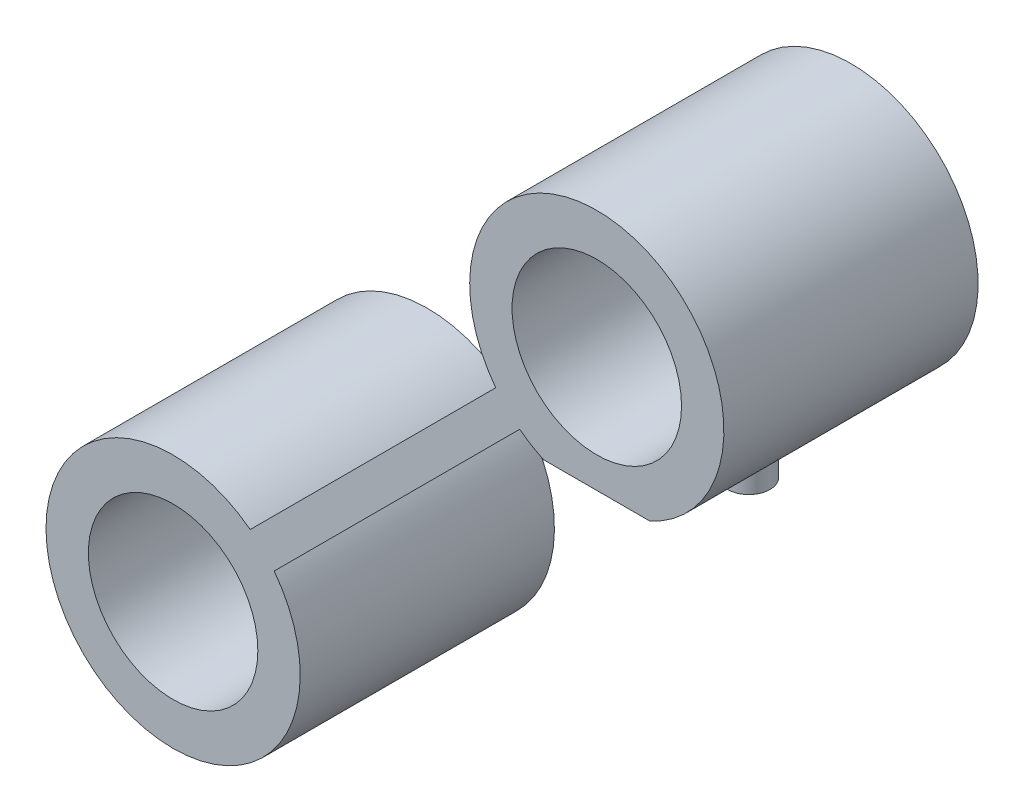
ISO-10303-21;
HEADER;
FILE_DESCRIPTION(('STEP AP214'),'2;1');
FILE_NAME('part.step','',(''),(''),'','','');
FILE_SCHEMA(('AUTOMOTIVE_DESIGN { 1 0 10303 214 1 1 1 1 }'));
ENDSEC;
DATA;
#1=APPLICATION_CONTEXT('core data for automotive mechanical design processes');
#2=APPLICATION_PROTOCOL_DEFINITION('international standard','automotive_design',2000,#1);
#3=PRODUCT_CONTEXT('',#1,'mechanical');
#4=PRODUCT('Part','Part','',(#3));
#5=PRODUCT_RELATED_PRODUCT_CATEGORY('part','',(#4));
#6=PRODUCT_DEFINITION_FORMATION('','',#4);
#7=PRODUCT_DEFINITION_CONTEXT('part definition',#1,'design');
#8=PRODUCT_DEFINITION('design','',#6,#7);
#9=PRODUCT_DEFINITION_SHAPE('','',#8);
#10=(LENGTH_UNIT() NAMED_UNIT(*) SI_UNIT(.MILLI.,.METRE.));
#11=(NAMED_UNIT(*) PLANE_ANGLE_UNIT() SI_UNIT($,.RADIAN.));
#12=(NAMED_UNIT(*) SI_UNIT($,.STERADIAN.) SOLID_ANGLE_UNIT());
#13=UNCERTAINTY_MEASURE_WITH_UNIT(LENGTH_MEASURE(1.E-05),#10,'distance_accuracy_value','');
#14=(GEOMETRIC_REPRESENTATION_CONTEXT(3) GLOBAL_UNCERTAINTY_ASSIGNED_CONTEXT((#13)) GLOBAL_UNIT_ASSIGNED_CONTEXT((#10,
#11,#12)) REPRESENTATION_CONTEXT('',''));
#15=CARTESIAN_POINT('',(0.,0.,0.));
#16=DIRECTION('',(0.,0.,1.));
#17=DIRECTION('',(1.,0.,0.));
#18=AXIS2_PLACEMENT_3D('',#15,#16,#17);
#19=CARTESIAN_POINT('',(40.9001782531195,36.3694822992735,-153.808748883995));
#20=DIRECTION('',(0.,-1.,0.));
#21=DIRECTION('',(0.,0.,-1.));
#22=AXIS2_PLACEMENT_3D('',#19,#20,#21);
#23=PLANE('',#22);
#24=DIRECTION('',(1.,0.,0.));
#25=VECTOR('',#24,1.);
#26=CARTESIAN_POINT('',(0.,36.3694822992735,30.));
#27=LINE('',#26,#25);
#28=CARTESIAN_POINT('',(43.7382919893855,36.3694822992735,30.));
#29=VERTEX_POINT('',#28);
#30=CARTESIAN_POINT('',(56.2617080106141,36.3694822992735,30.));
#31=VERTEX_POINT('',#30);
#32=EDGE_CURVE('E59',#29,#31,#27,.T.);
#33=ORIENTED_EDGE('',*,*,#32,.F.);
#34=DIRECTION('',(0.,0.,-1.));
#35=VECTOR('',#34,1.);
#36=CARTESIAN_POINT('',(43.7382919893855,36.3694822992735,30.));
#37=LINE('',#36,#35);
#38=CARTESIAN_POINT('',(43.7382919893855,36.3694822992735,0.));
#39=VERTEX_POINT('',#38);
#40=EDGE_CURVE('E68',#29,#39,#37,.T.);
#41=ORIENTED_EDGE('',*,*,#40,.T.);
#42=DIRECTION('',(1.,0.,0.));
#43=VECTOR('',#42,1.);
#44=CARTESIAN_POINT('',(0.,36.3694822992735,0.));
#45=LINE('',#44,#43);
#46=CARTESIAN_POINT('',(56.2617080106141,36.3694822992735,0.));
#47=VERTEX_POINT('',#46);
#48=EDGE_CURVE('E11',#39,#47,#45,.T.);
#49=ORIENTED_EDGE('',*,*,#48,.T.);
#50=DIRECTION('',(0.,0.,-1.));
#51=VECTOR('',#50,1.);
#52=CARTESIAN_POINT('',(56.2617080106141,36.3694822992735,30.));
#53=LINE('',#52,#51);
#54=EDGE_CURVE('E109',#47,#31,#53,.F.);
#55=ORIENTED_EDGE('',*,*,#54,.T.);
#56=EDGE_LOOP('',(#33,#41,#49,#55));
#57=FACE_BOUND('',#56,.T.);
#58=CARTESIAN_POINT('',(49.6260615815451,36.3694822992735,11.687427951216));
#59=DIRECTION('',(0.,-1.,0.));
#60=DIRECTION('',(0.,0.,-1.));
#61=AXIS2_PLACEMENT_3D('',#58,#59,#60);
#62=CIRCLE('',#61,2.5);
#63=CARTESIAN_POINT('',(49.6260615815451,36.3694822992735,9.18742795121602));
#64=VERTEX_POINT('',#63);
#65=EDGE_CURVE('E220',#64,#64,#62,.T.);
#66=ORIENTED_EDGE('',*,*,#65,.F.);
#67=EDGE_LOOP('',(#66));
#68=FACE_BOUND('',#67,.T.);
#69=ADVANCED_FACE('F43',(#57,#68),#23,.T.);
#70=CARTESIAN_POINT('',(49.9999999999998,49.9999999999998,30.));
#71=DIRECTION('',(0.,0.,-1.));
#72=DIRECTION('',(-1.,0.,0.));
#73=AXIS2_PLACEMENT_3D('',#70,#71,#72);
#74=CYLINDRICAL_SURFACE('',#73,15.0000000000001);
#75=ORIENTED_EDGE('',*,*,#40,.F.);
#76=CARTESIAN_POINT('',(49.9999999999998,49.9999999999998,30.));
#77=DIRECTION('',(0.,0.,1.));
#78=DIRECTION('',(1.,0.,0.));
#79=AXIS2_PLACEMENT_3D('',#76,#77,#78);
#80=CIRCLE('',#79,15.0000000000001);
#81=CARTESIAN_POINT('',(40.9023155415585,38.0738884168123,30.));
#82=VERTEX_POINT('',#81);
#83=EDGE_CURVE('E134',#82,#29,#80,.T.);
#84=ORIENTED_EDGE('',*,*,#83,.F.);
#85=DIRECTION('',(0.,0.,-1.));
#86=VECTOR('',#85,1.);
#87=CARTESIAN_POINT('',(40.9023155415585,38.0738884168123,30.));
#88=LINE('',#87,#86);
#89=CARTESIAN_POINT('',(40.9023155415585,38.0738884168123,0.));
#90=VERTEX_POINT('',#89);
#91=EDGE_CURVE('E153',#82,#90,#88,.T.);
#92=ORIENTED_EDGE('',*,*,#91,.T.);
#93=CARTESIAN_POINT('',(49.9999999999998,49.9999999999998,0.));
#94=DIRECTION('',(0.,0.,1.));
#95=DIRECTION('',(1.,0.,0.));
#96=AXIS2_PLACEMENT_3D('',#93,#94,#95);
#97=CIRCLE('',#96,15.0000000000001);
#98=EDGE_CURVE('E106',#90,#39,#97,.T.);
#99=ORIENTED_EDGE('',*,*,#98,.T.);
#100=EDGE_LOOP('',(#75,#84,#92,#99));
#101=FACE_BOUND('',#100,.T.);
#102=ADVANCED_FACE('F162',(#101),#74,.T.);
#103=ORIENTED_EDGE('',*,*,#54,.F.);
#104=CARTESIAN_POINT('',(38.0738884168123,40.9023155415585,0.));
#105=VERTEX_POINT('',#104);
#106=EDGE_CURVE('E100',#47,#105,#97,.T.);
#107=ORIENTED_EDGE('',*,*,#106,.T.);
#108=DIRECTION('',(0.,0.,-1.));
#109=VECTOR('',#108,1.);
#110=CARTESIAN_POINT('',(38.0738884168123,40.9023155415585,30.));
#111=LINE('',#110,#109);
#112=CARTESIAN_POINT('',(38.0738884168123,40.9023155415585,30.));
#113=VERTEX_POINT('',#112);
#114=EDGE_CURVE('E151',#113,#105,#111,.T.);
#115=ORIENTED_EDGE('',*,*,#114,.F.);
#116=EDGE_CURVE('E115',#31,#113,#80,.T.);
#117=ORIENTED_EDGE('',*,*,#116,.F.);
#118=EDGE_LOOP('',(#103,#107,#115,#117));
#119=FACE_BOUND('',#118,.T.);
#120=ADVANCED_FACE('F112',(#119),#74,.T.);
#121=CARTESIAN_POINT('',(0.,0.,30.));
#122=DIRECTION('',(0.,0.,1.));
#123=DIRECTION('',(1.,0.,0.));
#124=AXIS2_PLACEMENT_3D('',#121,#122,#123);
#125=PLANE('',#124);
#126=CARTESIAN_POINT('',(49.9999999999998,49.9999999999998,30.));
#127=DIRECTION('',(0.,0.,1.));
#128=DIRECTION('',(1.,0.,0.));
#129=AXIS2_PLACEMENT_3D('',#126,#127,#128);
#130=CIRCLE('',#129,10.);
#131=CARTESIAN_POINT('',(59.9999999999998,49.9999999999998,30.));
#132=VERTEX_POINT('',#131);
#133=EDGE_CURVE('E132',#132,#132,#130,.T.);
#134=ORIENTED_EDGE('',*,*,#133,.F.);
#135=EDGE_LOOP('',(#134));
#136=FACE_BOUND('',#135,.T.);
#137=CARTESIAN_POINT('',(0.,0.,30.));
#138=DIRECTION('',(0.,0.,1.));
#139=DIRECTION('',(1.,0.,0.));
#140=AXIS2_PLACEMENT_3D('',#137,#138,#139);
#141=CIRCLE('',#140,10.);
#142=CARTESIAN_POINT('',(10.,0.,30.));
#143=VERTEX_POINT('',#142);
#144=EDGE_CURVE('E124',#143,#143,#141,.T.);
#145=ORIENTED_EDGE('',*,*,#144,.F.);
#146=EDGE_LOOP('',(#145));
#147=FACE_BOUND('',#146,.T.);
#148=ORIENTED_EDGE('',*,*,#83,.T.);
#149=ORIENTED_EDGE('',*,*,#32,.T.);
#150=ORIENTED_EDGE('',*,*,#116,.T.);
#151=DIRECTION('',(-0.707106781186548,-0.707106781186547,0.));
#152=VECTOR('',#151,1.);
#153=CARTESIAN_POINT('',(-1.4142135623731,1.4142135623731,30.));
#154=LINE('',#153,#152);
#155=CARTESIAN_POINT('',(9.09768445844131,11.9261115831875,30.));
#156=VERTEX_POINT('',#155);
#157=EDGE_CURVE('E135',#113,#156,#154,.T.);
#158=ORIENTED_EDGE('',*,*,#157,.T.);
#159=CARTESIAN_POINT('',(0.,0.,30.));
#160=DIRECTION('',(0.,0.,1.));
#161=DIRECTION('',(1.,0.,0.));
#162=AXIS2_PLACEMENT_3D('',#159,#160,#161);
#163=CIRCLE('',#162,15.0000000000001);
#164=CARTESIAN_POINT('',(11.9261115831875,9.09768445844131,30.));
#165=VERTEX_POINT('',#164);
#166=EDGE_CURVE('E121',#156,#165,#163,.T.);
#167=ORIENTED_EDGE('',*,*,#166,.T.);
#168=DIRECTION('',(-0.707106781186547,-0.707106781186548,0.));
#169=VECTOR('',#168,1.);
#170=CARTESIAN_POINT('',(1.4142135623731,-1.4142135623731,30.));
#171=LINE('',#170,#169);
#172=EDGE_CURVE('E126',#82,#165,#171,.T.);
#173=ORIENTED_EDGE('',*,*,#172,.F.);
#174=EDGE_LOOP('',(#148,#149,#150,#158,#167,#173));
#175=FACE_BOUND('',#174,.T.);
#176=ADVANCED_FACE('F163',(#136,#147,#175),#125,.T.);
#177=CARTESIAN_POINT('',(0.,0.,0.));
#178=DIRECTION('',(0.,0.,1.));
#179=DIRECTION('',(1.,0.,0.));
#180=AXIS2_PLACEMENT_3D('',#177,#178,#179);
#181=PLANE('',#180);
#182=CARTESIAN_POINT('',(49.9999999999998,49.9999999999998,0.));
#183=DIRECTION('',(0.,0.,1.));
#184=DIRECTION('',(1.,0.,0.));
#185=AXIS2_PLACEMENT_3D('',#182,#183,#184);
#186=CIRCLE('',#185,10.);
#187=CARTESIAN_POINT('',(59.9999999999998,49.9999999999998,0.));
#188=VERTEX_POINT('',#187);
#189=EDGE_CURVE('E127',#188,#188,#186,.T.);
#190=ORIENTED_EDGE('',*,*,#189,.T.);
#191=EDGE_LOOP('',(#190));
#192=FACE_BOUND('',#191,.T.);
#193=CARTESIAN_POINT('',(0.,0.,0.));
#194=DIRECTION('',(0.,0.,1.));
#195=DIRECTION('',(1.,0.,0.));
#196=AXIS2_PLACEMENT_3D('',#193,#194,#195);
#197=CIRCLE('',#196,10.);
#198=CARTESIAN_POINT('',(10.,0.,0.));
#199=VERTEX_POINT('',#198);
#200=EDGE_CURVE('E120',#199,#199,#197,.T.);
#201=ORIENTED_EDGE('',*,*,#200,.T.);
#202=EDGE_LOOP('',(#201));
#203=FACE_BOUND('',#202,.T.);
#204=ORIENTED_EDGE('',*,*,#48,.F.);
#205=ORIENTED_EDGE('',*,*,#98,.F.);
#206=DIRECTION('',(-0.707106781186547,-0.707106781186548,0.));
#207=VECTOR('',#206,1.);
#208=CARTESIAN_POINT('',(1.4142135623731,-1.4142135623731,0.));
#209=LINE('',#208,#207);
#210=CARTESIAN_POINT('',(11.9261115831875,9.09768445844131,0.));
#211=VERTEX_POINT('',#210);
#212=EDGE_CURVE('E110',#90,#211,#209,.T.);
#213=ORIENTED_EDGE('',*,*,#212,.T.);
#214=CARTESIAN_POINT('',(0.,0.,0.));
#215=DIRECTION('',(0.,0.,1.));
#216=DIRECTION('',(1.,0.,0.));
#217=AXIS2_PLACEMENT_3D('',#214,#215,#216);
#218=CIRCLE('',#217,15.0000000000001);
#219=CARTESIAN_POINT('',(9.09768445844131,11.9261115831875,0.));
#220=VERTEX_POINT('',#219);
#221=EDGE_CURVE('E143',#220,#211,#218,.T.);
#222=ORIENTED_EDGE('',*,*,#221,.F.);
#223=DIRECTION('',(-0.707106781186548,-0.707106781186547,0.));
#224=VECTOR('',#223,1.);
#225=CARTESIAN_POINT('',(-1.4142135623731,1.4142135623731,0.));
#226=LINE('',#225,#224);
#227=EDGE_CURVE('E105',#105,#220,#226,.T.);
#228=ORIENTED_EDGE('',*,*,#227,.F.);
#229=ORIENTED_EDGE('',*,*,#106,.F.);
#230=EDGE_LOOP('',(#204,#205,#213,#222,#228,#229));
#231=FACE_BOUND('',#230,.T.);
#232=ADVANCED_FACE('F97',(#192,#203,#231),#181,.F.);
#233=CARTESIAN_POINT('',(0.,0.,30.));
#234=DIRECTION('',(0.,0.,-1.));
#235=DIRECTION('',(-1.,0.,0.));
#236=AXIS2_PLACEMENT_3D('',#233,#234,#235);
#237=CYLINDRICAL_SURFACE('',#236,15.0000000000001);
#238=ORIENTED_EDGE('',*,*,#221,.T.);
#239=DIRECTION('',(0.,0.,-1.));
#240=VECTOR('',#239,1.);
#241=CARTESIAN_POINT('',(11.9261115831875,9.09768445844131,30.));
#242=LINE('',#241,#240);
#243=EDGE_CURVE('E51',#165,#211,#242,.T.);
#244=ORIENTED_EDGE('',*,*,#243,.F.);
#245=ORIENTED_EDGE('',*,*,#166,.F.);
#246=DIRECTION('',(0.,0.,-1.));
#247=VECTOR('',#246,1.);
#248=CARTESIAN_POINT('',(9.09768445844131,11.9261115831875,30.));
#249=LINE('',#248,#247);
#250=EDGE_CURVE('E137',#156,#220,#249,.T.);
#251=ORIENTED_EDGE('',*,*,#250,.T.);
#252=EDGE_LOOP('',(#238,#244,#245,#251));
#253=FACE_BOUND('',#252,.T.);
#254=ADVANCED_FACE('F161',(#253),#237,.T.);
#255=CARTESIAN_POINT('',(1.4142135623731,-1.4142135623731,30.));
#256=DIRECTION('',(0.707106781186548,-0.707106781186547,0.));
#257=DIRECTION('',(0.707106781186547,0.707106781186548,0.));
#258=AXIS2_PLACEMENT_3D('',#255,#256,#257);
#259=PLANE('',#258);
#260=ORIENTED_EDGE('',*,*,#212,.F.);
#261=ORIENTED_EDGE('',*,*,#91,.F.);
#262=ORIENTED_EDGE('',*,*,#172,.T.);
#263=ORIENTED_EDGE('',*,*,#243,.T.);
#264=EDGE_LOOP('',(#260,#261,#262,#263));
#265=FACE_BOUND('',#264,.T.);
#266=ADVANCED_FACE('F160',(#265),#259,.T.);
#267=CARTESIAN_POINT('',(-1.4142135623731,1.4142135623731,30.));
#268=DIRECTION('',(0.707106781186547,-0.707106781186548,0.));
#269=DIRECTION('',(0.707106781186548,0.707106781186547,0.));
#270=AXIS2_PLACEMENT_3D('',#267,#268,#269);
#271=PLANE('',#270);
#272=ORIENTED_EDGE('',*,*,#227,.T.);
#273=ORIENTED_EDGE('',*,*,#250,.F.);
#274=ORIENTED_EDGE('',*,*,#157,.F.);
#275=ORIENTED_EDGE('',*,*,#114,.T.);
#276=EDGE_LOOP('',(#272,#273,#274,#275));
#277=FACE_BOUND('',#276,.T.);
#278=ADVANCED_FACE('F170',(#277),#271,.F.);
#279=CARTESIAN_POINT('',(0.,0.,30.));
#280=DIRECTION('',(0.,0.,-1.));
#281=DIRECTION('',(-1.,0.,0.));
#282=AXIS2_PLACEMENT_3D('',#279,#280,#281);
#283=CYLINDRICAL_SURFACE('',#282,10.);
#284=ORIENTED_EDGE('',*,*,#144,.T.);
#285=EDGE_LOOP('',(#284));
#286=FACE_BOUND('',#285,.T.);
#287=ORIENTED_EDGE('',*,*,#200,.F.);
#288=EDGE_LOOP('',(#287));
#289=FACE_BOUND('',#288,.T.);
#290=ADVANCED_FACE('F44',(#286,#289),#283,.F.);
#291=CARTESIAN_POINT('',(49.9999999999998,49.9999999999998,30.));
#292=DIRECTION('',(0.,0.,-1.));
#293=DIRECTION('',(-1.,0.,0.));
#294=AXIS2_PLACEMENT_3D('',#291,#292,#293);
#295=CYLINDRICAL_SURFACE('',#294,10.);
#296=ORIENTED_EDGE('',*,*,#133,.T.);
#297=EDGE_LOOP('',(#296));
#298=FACE_BOUND('',#297,.T.);
#299=ORIENTED_EDGE('',*,*,#189,.F.);
#300=EDGE_LOOP('',(#299));
#301=FACE_BOUND('',#300,.T.);
#302=ADVANCED_FACE('F173',(#298,#301),#295,.F.);
#303=CARTESIAN_POINT('',(49.6260615815451,28.3694822992735,11.687427951216));
#304=DIRECTION('',(0.,1.,0.));
#305=DIRECTION('',(0.,0.,1.));
#306=AXIS2_PLACEMENT_3D('',#303,#304,#305);
#307=CYLINDRICAL_SURFACE('',#306,2.5);
#308=CARTESIAN_POINT('',(49.6260615815451,28.3694822992735,11.687427951216));
#309=DIRECTION('',(0.,-1.,0.));
#310=DIRECTION('',(0.,0.,-1.));
#311=AXIS2_PLACEMENT_3D('',#308,#309,#310);
#312=CIRCLE('',#311,2.5);
#313=CARTESIAN_POINT('',(49.6260615815451,28.3694822992735,9.18742795121602));
#314=VERTEX_POINT('',#313);
#315=EDGE_CURVE('E111',#314,#314,#312,.T.);
#316=ORIENTED_EDGE('',*,*,#315,.F.);
#317=EDGE_LOOP('',(#316));
#318=FACE_BOUND('',#317,.T.);
#319=ORIENTED_EDGE('',*,*,#65,.T.);
#320=EDGE_LOOP('',(#319));
#321=FACE_BOUND('',#320,.T.);
#322=ADVANCED_FACE('F190',(#318,#321),#307,.T.);
#323=CARTESIAN_POINT('',(49.6260615815451,28.3694822992735,11.687427951216));
#324=DIRECTION('',(0.,-1.,0.));
#325=DIRECTION('',(0.,0.,-1.));
#326=AXIS2_PLACEMENT_3D('',#323,#324,#325);
#327=PLANE('',#326);
#328=ORIENTED_EDGE('',*,*,#315,.T.);
#329=EDGE_LOOP('',(#328));
#330=FACE_BOUND('',#329,.T.);
#331=ADVANCED_FACE('F196',(#330),#327,.T.);
#332=CLOSED_SHELL('',(#69,#102,#120,#176,#232,#254,#266,#278,#290,#302,#322,#331));
#333=MANIFOLD_SOLID_BREP('B2',#332);
#334=ADVANCED_BREP_SHAPE_REPRESENTATION('',(#18,#333),#14);
#335=SHAPE_DEFINITION_REPRESENTATION(#9,#334);
ENDSEC;
END-ISO-10303-21;
